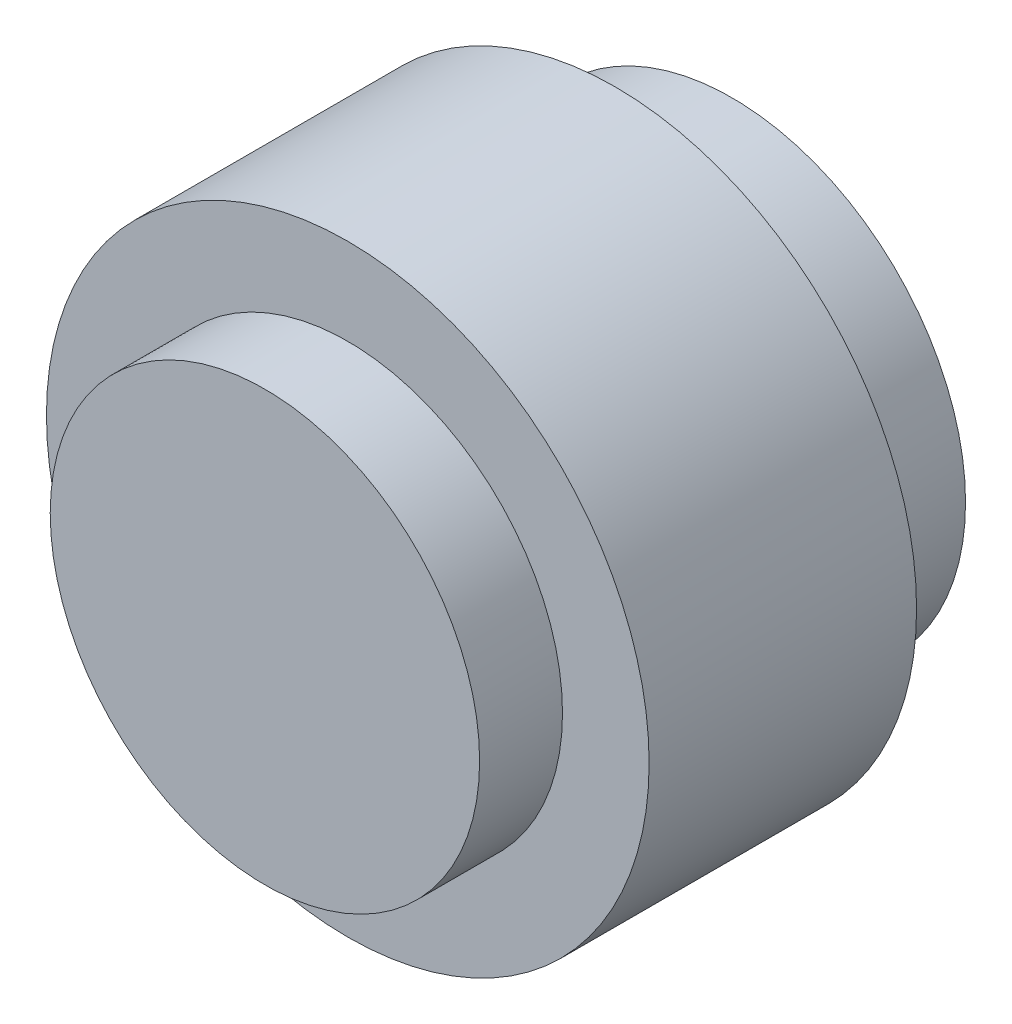
ISO-10303-21;
HEADER;
FILE_DESCRIPTION(('STEP AP214'),'2;1');
FILE_NAME('part.step','',(''),(''),'','','');
FILE_SCHEMA(('AUTOMOTIVE_DESIGN { 1 0 10303 214 1 1 1 1 }'));
ENDSEC;
DATA;
#1=APPLICATION_CONTEXT('core data for automotive mechanical design processes');
#2=APPLICATION_PROTOCOL_DEFINITION('international standard','automotive_design',2000,#1);
#3=PRODUCT_CONTEXT('',#1,'mechanical');
#4=PRODUCT('Part','Part','',(#3));
#5=PRODUCT_RELATED_PRODUCT_CATEGORY('part','',(#4));
#6=PRODUCT_DEFINITION_FORMATION('','',#4);
#7=PRODUCT_DEFINITION_CONTEXT('part definition',#1,'design');
#8=PRODUCT_DEFINITION('design','',#6,#7);
#9=PRODUCT_DEFINITION_SHAPE('','',#8);
#10=(LENGTH_UNIT() NAMED_UNIT(*) SI_UNIT(.MILLI.,.METRE.));
#11=(NAMED_UNIT(*) PLANE_ANGLE_UNIT() SI_UNIT($,.RADIAN.));
#12=(NAMED_UNIT(*) SI_UNIT($,.STERADIAN.) SOLID_ANGLE_UNIT());
#13=UNCERTAINTY_MEASURE_WITH_UNIT(LENGTH_MEASURE(1.E-05),#10,'distance_accuracy_value','');
#14=(GEOMETRIC_REPRESENTATION_CONTEXT(3) GLOBAL_UNCERTAINTY_ASSIGNED_CONTEXT((#13)) GLOBAL_UNIT_ASSIGNED_CONTEXT((#10,
#11,#12)) REPRESENTATION_CONTEXT('',''));
#15=CARTESIAN_POINT('',(0.,0.,0.));
#16=DIRECTION('',(0.,0.,1.));
#17=DIRECTION('',(1.,0.,0.));
#18=AXIS2_PLACEMENT_3D('',#15,#16,#17);
#19=CARTESIAN_POINT('',(0.,0.,-35.5));
#20=DIRECTION('',(0.,0.,1.));
#21=DIRECTION('',(1.,0.,0.));
#22=AXIS2_PLACEMENT_3D('',#19,#20,#21);
#23=PLANE('',#22);
#24=CARTESIAN_POINT('',(0.,0.,-35.5));
#25=DIRECTION('',(0.,0.,1.));
#26=DIRECTION('',(1.,0.,0.));
#27=AXIS2_PLACEMENT_3D('',#24,#25,#26);
#28=CIRCLE('',#27,40.);
#29=CARTESIAN_POINT('',(40.,0.,-35.5));
#30=VERTEX_POINT('',#29);
#31=EDGE_CURVE('E162',#30,#30,#28,.T.);
#32=ORIENTED_EDGE('',*,*,#31,.F.);
#33=EDGE_LOOP('',(#32));
#34=FACE_BOUND('',#33,.T.);
#35=CARTESIAN_POINT('',(26.1629509039017,26.162950903901,-35.5));
#36=DIRECTION('',(0.,0.,-1.));
#37=DIRECTION('',(-1.,0.,0.));
#38=AXIS2_PLACEMENT_3D('',#35,#36,#37);
#39=CIRCLE('',#38,1.525);
#40=CARTESIAN_POINT('',(24.6379509039017,26.162950903901,-35.5));
#41=VERTEX_POINT('',#40);
#42=EDGE_CURVE('E152',#41,#41,#39,.T.);
#43=ORIENTED_EDGE('',*,*,#42,.F.);
#44=EDGE_LOOP('',(#43));
#45=FACE_BOUND('',#44,.T.);
#46=CARTESIAN_POINT('',(36.9999999999982,-1.78707745073788E-12,-35.5));
#47=DIRECTION('',(0.,0.,-1.));
#48=DIRECTION('',(-1.,0.,0.));
#49=AXIS2_PLACEMENT_3D('',#46,#47,#48);
#50=CIRCLE('',#49,1.525);
#51=CARTESIAN_POINT('',(35.4749999999982,-1.78707745073788E-12,-35.5));
#52=VERTEX_POINT('',#51);
#53=EDGE_CURVE('E143',#52,#52,#50,.T.);
#54=ORIENTED_EDGE('',*,*,#53,.F.);
#55=EDGE_LOOP('',(#54));
#56=FACE_BOUND('',#55,.T.);
#57=CARTESIAN_POINT('',(26.1629509038992,-26.1629509039035,-35.5));
#58=DIRECTION('',(0.,0.,-1.));
#59=DIRECTION('',(-1.,0.,0.));
#60=AXIS2_PLACEMENT_3D('',#57,#58,#59);
#61=CIRCLE('',#60,1.525);
#62=CARTESIAN_POINT('',(24.6379509038992,-26.1629509039035,-35.5));
#63=VERTEX_POINT('',#62);
#64=EDGE_CURVE('E134',#63,#63,#61,.T.);
#65=ORIENTED_EDGE('',*,*,#64,.F.);
#66=EDGE_LOOP('',(#65));
#67=FACE_BOUND('',#66,.T.);
#68=CARTESIAN_POINT('',(-3.56509251516207E-12,-37.,-35.5));
#69=DIRECTION('',(0.,0.,-1.));
#70=DIRECTION('',(-1.,0.,0.));
#71=AXIS2_PLACEMENT_3D('',#68,#69,#70);
#72=CIRCLE('',#71,1.525);
#73=CARTESIAN_POINT('',(-1.52500000000357,-37.,-35.5));
#74=VERTEX_POINT('',#73);
#75=EDGE_CURVE('E125',#74,#74,#72,.T.);
#76=ORIENTED_EDGE('',*,*,#75,.F.);
#77=EDGE_LOOP('',(#76));
#78=FACE_BOUND('',#77,.T.);
#79=CARTESIAN_POINT('',(-26.1629509039053,-26.162950903901,-35.5));
#80=DIRECTION('',(0.,0.,-1.));
#81=DIRECTION('',(-1.,0.,0.));
#82=AXIS2_PLACEMENT_3D('',#79,#80,#81);
#83=CIRCLE('',#82,1.525);
#84=CARTESIAN_POINT('',(-27.6879509039053,-26.162950903901,-35.5));
#85=VERTEX_POINT('',#84);
#86=EDGE_CURVE('E116',#85,#85,#83,.T.);
#87=ORIENTED_EDGE('',*,*,#86,.F.);
#88=EDGE_LOOP('',(#87));
#89=FACE_BOUND('',#88,.T.);
#90=CARTESIAN_POINT('',(-37.0000000000018,1.78254625758104E-12,-35.5));
#91=DIRECTION('',(0.,0.,-1.));
#92=DIRECTION('',(-1.,0.,0.));
#93=AXIS2_PLACEMENT_3D('',#90,#91,#92);
#94=CIRCLE('',#93,1.525);
#95=CARTESIAN_POINT('',(-38.5250000000018,1.78254625758104E-12,-35.5));
#96=VERTEX_POINT('',#95);
#97=EDGE_CURVE('E107',#96,#96,#94,.T.);
#98=ORIENTED_EDGE('',*,*,#97,.F.);
#99=EDGE_LOOP('',(#98));
#100=FACE_BOUND('',#99,.T.);
#101=CARTESIAN_POINT('',(-26.1629509039028,26.1629509039035,-35.5));
#102=DIRECTION('',(0.,0.,-1.));
#103=DIRECTION('',(-1.,0.,0.));
#104=AXIS2_PLACEMENT_3D('',#101,#102,#103);
#105=CIRCLE('',#104,1.525);
#106=CARTESIAN_POINT('',(-27.6879509039028,26.1629509039035,-35.5));
#107=VERTEX_POINT('',#106);
#108=EDGE_CURVE('E91',#107,#107,#105,.T.);
#109=ORIENTED_EDGE('',*,*,#108,.F.);
#110=EDGE_LOOP('',(#109));
#111=FACE_BOUND('',#110,.T.);
#112=CARTESIAN_POINT('',(0.,37.,-35.5));
#113=DIRECTION('',(0.,0.,-1.));
#114=DIRECTION('',(-1.,0.,0.));
#115=AXIS2_PLACEMENT_3D('',#112,#113,#114);
#116=CIRCLE('',#115,1.525);
#117=CARTESIAN_POINT('',(-1.525,37.,-35.5));
#118=VERTEX_POINT('',#117);
#119=EDGE_CURVE('E98',#118,#118,#116,.T.);
#120=ORIENTED_EDGE('',*,*,#119,.F.);
#121=EDGE_LOOP('',(#120));
#122=FACE_BOUND('',#121,.T.);
#123=CARTESIAN_POINT('',(0.,0.,-35.5));
#124=DIRECTION('',(0.,0.,1.));
#125=DIRECTION('',(1.,0.,0.));
#126=AXIS2_PLACEMENT_3D('',#123,#124,#125);
#127=CIRCLE('',#126,31.);
#128=CARTESIAN_POINT('',(31.,0.,-35.5));
#129=VERTEX_POINT('',#128);
#130=EDGE_CURVE('E11',#129,#129,#127,.F.);
#131=ORIENTED_EDGE('',*,*,#130,.F.);
#132=EDGE_LOOP('',(#131));
#133=FACE_BOUND('',#132,.T.);
#134=ADVANCED_FACE('F48',(#34,#45,#56,#67,#78,#89,#100,#111,#122,#133),#23,.F.);
#135=CARTESIAN_POINT('',(0.,0.,11.));
#136=DIRECTION('',(0.,0.,-1.));
#137=DIRECTION('',(-1.,0.,0.));
#138=AXIS2_PLACEMENT_3D('',#135,#136,#137);
#139=CYLINDRICAL_SURFACE('',#138,28.5);
#140=CARTESIAN_POINT('',(0.,0.,11.));
#141=DIRECTION('',(0.,0.,1.));
#142=DIRECTION('',(1.,0.,0.));
#143=AXIS2_PLACEMENT_3D('',#140,#141,#142);
#144=CIRCLE('',#143,28.5);
#145=CARTESIAN_POINT('',(28.5,0.,11.));
#146=VERTEX_POINT('',#145);
#147=EDGE_CURVE('E170',#146,#146,#144,.T.);
#148=ORIENTED_EDGE('',*,*,#147,.F.);
#149=EDGE_LOOP('',(#148));
#150=FACE_BOUND('',#149,.T.);
#151=CARTESIAN_POINT('',(0.,0.,0.));
#152=DIRECTION('',(0.,0.,1.));
#153=DIRECTION('',(1.,0.,0.));
#154=AXIS2_PLACEMENT_3D('',#151,#152,#153);
#155=CIRCLE('',#154,28.5);
#156=CARTESIAN_POINT('',(28.5,0.,0.));
#157=VERTEX_POINT('',#156);
#158=EDGE_CURVE('E165',#157,#157,#155,.T.);
#159=ORIENTED_EDGE('',*,*,#158,.T.);
#160=EDGE_LOOP('',(#159));
#161=FACE_BOUND('',#160,.T.);
#162=ADVANCED_FACE('F50',(#150,#161),#139,.T.);
#163=CARTESIAN_POINT('',(0.,0.,11.));
#164=DIRECTION('',(0.,0.,1.));
#165=DIRECTION('',(1.,0.,0.));
#166=AXIS2_PLACEMENT_3D('',#163,#164,#165);
#167=PLANE('',#166);
#168=ORIENTED_EDGE('',*,*,#147,.T.);
#169=EDGE_LOOP('',(#168));
#170=FACE_BOUND('',#169,.T.);
#171=ADVANCED_FACE('F196',(#170),#167,.T.);
#172=CARTESIAN_POINT('',(0.,0.,-35.5));
#173=DIRECTION('',(0.,0.,1.));
#174=DIRECTION('',(1.,0.,0.));
#175=AXIS2_PLACEMENT_3D('',#172,#173,#174);
#176=CYLINDRICAL_SURFACE('',#175,40.);
#177=ORIENTED_EDGE('',*,*,#31,.T.);
#178=EDGE_LOOP('',(#177));
#179=FACE_BOUND('',#178,.T.);
#180=CARTESIAN_POINT('',(0.,0.,0.));
#181=DIRECTION('',(0.,0.,1.));
#182=DIRECTION('',(1.,0.,0.));
#183=AXIS2_PLACEMENT_3D('',#180,#181,#182);
#184=CIRCLE('',#183,40.);
#185=CARTESIAN_POINT('',(40.,0.,0.));
#186=VERTEX_POINT('',#185);
#187=EDGE_CURVE('E161',#186,#186,#184,.T.);
#188=ORIENTED_EDGE('',*,*,#187,.F.);
#189=EDGE_LOOP('',(#188));
#190=FACE_BOUND('',#189,.T.);
#191=ADVANCED_FACE('F206',(#179,#190),#176,.T.);
#192=CARTESIAN_POINT('',(0.,0.,0.));
#193=DIRECTION('',(0.,0.,1.));
#194=DIRECTION('',(1.,0.,0.));
#195=AXIS2_PLACEMENT_3D('',#192,#193,#194);
#196=PLANE('',#195);
#197=ORIENTED_EDGE('',*,*,#158,.F.);
#198=EDGE_LOOP('',(#197));
#199=FACE_BOUND('',#198,.T.);
#200=ORIENTED_EDGE('',*,*,#187,.T.);
#201=EDGE_LOOP('',(#200));
#202=FACE_BOUND('',#201,.T.);
#203=ADVANCED_FACE('F204',(#199,#202),#196,.T.);
#204=CARTESIAN_POINT('',(26.1629509039017,26.162950903901,-30.5));
#205=DIRECTION('',(0.,0.,-1.));
#206=DIRECTION('',(-1.,0.,0.));
#207=AXIS2_PLACEMENT_3D('',#204,#205,#206);
#208=CONICAL_SURFACE('',#207,1.25,1.02974425867665);
#209=CARTESIAN_POINT('',(26.1629509039017,26.162950903901,-29.7489242262155));
#210=VERTEX_POINT('',#209);
#211=VERTEX_LOOP('',#210);
#212=FACE_BOUND('',#211,.T.);
#213=CARTESIAN_POINT('',(26.1629509039017,26.162950903901,-30.5));
#214=DIRECTION('',(0.,0.,-1.));
#215=DIRECTION('',(-1.,0.,0.));
#216=AXIS2_PLACEMENT_3D('',#213,#214,#215);
#217=CIRCLE('',#216,1.25);
#218=CARTESIAN_POINT('',(24.9129509039017,26.162950903901,-30.5));
#219=VERTEX_POINT('',#218);
#220=EDGE_CURVE('E158',#219,#219,#217,.T.);
#221=ORIENTED_EDGE('',*,*,#220,.T.);
#222=EDGE_LOOP('',(#221));
#223=FACE_BOUND('',#222,.T.);
#224=ADVANCED_FACE('F202',(#212,#223),#208,.F.);
#225=CARTESIAN_POINT('',(26.1629509039017,26.162950903901,-35.5));
#226=DIRECTION('',(0.,0.,-1.));
#227=DIRECTION('',(-1.,0.,0.));
#228=AXIS2_PLACEMENT_3D('',#225,#226,#227);
#229=CYLINDRICAL_SURFACE('',#228,1.25);
#230=ORIENTED_EDGE('',*,*,#220,.F.);
#231=EDGE_LOOP('',(#230));
#232=FACE_BOUND('',#231,.T.);
#233=CARTESIAN_POINT('',(26.1629509039017,26.162950903901,-35.225));
#234=DIRECTION('',(0.,0.,-1.));
#235=DIRECTION('',(-1.,0.,0.));
#236=AXIS2_PLACEMENT_3D('',#233,#234,#235);
#237=CIRCLE('',#236,1.25);
#238=CARTESIAN_POINT('',(24.9129509039017,26.162950903901,-35.225));
#239=VERTEX_POINT('',#238);
#240=EDGE_CURVE('E155',#239,#239,#237,.T.);
#241=ORIENTED_EDGE('',*,*,#240,.T.);
#242=EDGE_LOOP('',(#241));
#243=FACE_BOUND('',#242,.T.);
#244=ADVANCED_FACE('F237',(#232,#243),#229,.F.);
#245=CARTESIAN_POINT('',(26.1629509039017,26.162950903901,-35.5));
#246=DIRECTION('',(0.,0.,-1.));
#247=DIRECTION('',(-1.,0.,0.));
#248=AXIS2_PLACEMENT_3D('',#245,#246,#247);
#249=CONICAL_SURFACE('',#248,1.525,0.785398163397448);
#250=ORIENTED_EDGE('',*,*,#240,.F.);
#251=EDGE_LOOP('',(#250));
#252=FACE_BOUND('',#251,.T.);
#253=ORIENTED_EDGE('',*,*,#42,.T.);
#254=EDGE_LOOP('',(#253));
#255=FACE_BOUND('',#254,.T.);
#256=ADVANCED_FACE('F244',(#252,#255),#249,.F.);
#257=CARTESIAN_POINT('',(36.9999999999982,-1.78707745073788E-12,-30.5));
#258=DIRECTION('',(0.,0.,-1.));
#259=DIRECTION('',(-1.,0.,0.));
#260=AXIS2_PLACEMENT_3D('',#257,#258,#259);
#261=CONICAL_SURFACE('',#260,1.25,1.02974425867666);
#262=CARTESIAN_POINT('',(36.9999999999982,-1.78707745073788E-12,-29.7489242262155));
#263=VERTEX_POINT('',#262);
#264=VERTEX_LOOP('',#263);
#265=FACE_BOUND('',#264,.T.);
#266=CARTESIAN_POINT('',(36.9999999999982,-1.78707745073788E-12,-30.5));
#267=DIRECTION('',(0.,0.,-1.));
#268=DIRECTION('',(-1.,0.,0.));
#269=AXIS2_PLACEMENT_3D('',#266,#267,#268);
#270=CIRCLE('',#269,1.25);
#271=CARTESIAN_POINT('',(35.7499999999982,-1.78707745073788E-12,-30.5));
#272=VERTEX_POINT('',#271);
#273=EDGE_CURVE('E149',#272,#272,#270,.T.);
#274=ORIENTED_EDGE('',*,*,#273,.T.);
#275=EDGE_LOOP('',(#274));
#276=FACE_BOUND('',#275,.T.);
#277=ADVANCED_FACE('F252',(#265,#276),#261,.F.);
#278=CARTESIAN_POINT('',(36.9999999999982,-1.78707745073788E-12,-35.5));
#279=DIRECTION('',(0.,0.,-1.));
#280=DIRECTION('',(-1.,0.,0.));
#281=AXIS2_PLACEMENT_3D('',#278,#279,#280);
#282=CYLINDRICAL_SURFACE('',#281,1.25);
#283=ORIENTED_EDGE('',*,*,#273,.F.);
#284=EDGE_LOOP('',(#283));
#285=FACE_BOUND('',#284,.T.);
#286=CARTESIAN_POINT('',(36.9999999999982,-1.78707745073788E-12,-35.225));
#287=DIRECTION('',(0.,0.,-1.));
#288=DIRECTION('',(-1.,0.,0.));
#289=AXIS2_PLACEMENT_3D('',#286,#287,#288);
#290=CIRCLE('',#289,1.25);
#291=CARTESIAN_POINT('',(35.7499999999982,-1.78707745073788E-12,-35.225));
#292=VERTEX_POINT('',#291);
#293=EDGE_CURVE('E146',#292,#292,#290,.T.);
#294=ORIENTED_EDGE('',*,*,#293,.T.);
#295=EDGE_LOOP('',(#294));
#296=FACE_BOUND('',#295,.T.);
#297=ADVANCED_FACE('F262',(#285,#296),#282,.F.);
#298=CARTESIAN_POINT('',(36.9999999999982,-1.78707745073788E-12,-35.5));
#299=DIRECTION('',(0.,0.,-1.));
#300=DIRECTION('',(-1.,0.,0.));
#301=AXIS2_PLACEMENT_3D('',#298,#299,#300);
#302=CONICAL_SURFACE('',#301,1.525,0.785398163397448);
#303=ORIENTED_EDGE('',*,*,#293,.F.);
#304=EDGE_LOOP('',(#303));
#305=FACE_BOUND('',#304,.T.);
#306=ORIENTED_EDGE('',*,*,#53,.T.);
#307=EDGE_LOOP('',(#306));
#308=FACE_BOUND('',#307,.T.);
#309=ADVANCED_FACE('F269',(#305,#308),#302,.F.);
#310=CARTESIAN_POINT('',(26.1629509038992,-26.1629509039035,-30.5));
#311=DIRECTION('',(0.,0.,-1.));
#312=DIRECTION('',(-1.,0.,0.));
#313=AXIS2_PLACEMENT_3D('',#310,#311,#312);
#314=CONICAL_SURFACE('',#313,1.25,1.02974425867665);
#315=CARTESIAN_POINT('',(26.1629509038992,-26.1629509039035,-29.7489242262155));
#316=VERTEX_POINT('',#315);
#317=VERTEX_LOOP('',#316);
#318=FACE_BOUND('',#317,.T.);
#319=CARTESIAN_POINT('',(26.1629509038992,-26.1629509039035,-30.5));
#320=DIRECTION('',(0.,0.,-1.));
#321=DIRECTION('',(-1.,0.,0.));
#322=AXIS2_PLACEMENT_3D('',#319,#320,#321);
#323=CIRCLE('',#322,1.25);
#324=CARTESIAN_POINT('',(24.9129509038992,-26.1629509039035,-30.5));
#325=VERTEX_POINT('',#324);
#326=EDGE_CURVE('E140',#325,#325,#323,.T.);
#327=ORIENTED_EDGE('',*,*,#326,.T.);
#328=EDGE_LOOP('',(#327));
#329=FACE_BOUND('',#328,.T.);
#330=ADVANCED_FACE('F278',(#318,#329),#314,.F.);
#331=CARTESIAN_POINT('',(26.1629509038992,-26.1629509039035,-35.5));
#332=DIRECTION('',(0.,0.,-1.));
#333=DIRECTION('',(-1.,0.,0.));
#334=AXIS2_PLACEMENT_3D('',#331,#332,#333);
#335=CYLINDRICAL_SURFACE('',#334,1.25);
#336=ORIENTED_EDGE('',*,*,#326,.F.);
#337=EDGE_LOOP('',(#336));
#338=FACE_BOUND('',#337,.T.);
#339=CARTESIAN_POINT('',(26.1629509038992,-26.1629509039035,-35.225));
#340=DIRECTION('',(0.,0.,-1.));
#341=DIRECTION('',(-1.,0.,0.));
#342=AXIS2_PLACEMENT_3D('',#339,#340,#341);
#343=CIRCLE('',#342,1.25);
#344=CARTESIAN_POINT('',(24.9129509038992,-26.1629509039035,-35.225));
#345=VERTEX_POINT('',#344);
#346=EDGE_CURVE('E137',#345,#345,#343,.T.);
#347=ORIENTED_EDGE('',*,*,#346,.T.);
#348=EDGE_LOOP('',(#347));
#349=FACE_BOUND('',#348,.T.);
#350=ADVANCED_FACE('F287',(#338,#349),#335,.F.);
#351=CARTESIAN_POINT('',(26.1629509038992,-26.1629509039035,-35.5));
#352=DIRECTION('',(0.,0.,-1.));
#353=DIRECTION('',(-1.,0.,0.));
#354=AXIS2_PLACEMENT_3D('',#351,#352,#353);
#355=CONICAL_SURFACE('',#354,1.525,0.785398163397448);
#356=ORIENTED_EDGE('',*,*,#346,.F.);
#357=EDGE_LOOP('',(#356));
#358=FACE_BOUND('',#357,.T.);
#359=ORIENTED_EDGE('',*,*,#64,.T.);
#360=EDGE_LOOP('',(#359));
#361=FACE_BOUND('',#360,.T.);
#362=ADVANCED_FACE('F295',(#358,#361),#355,.F.);
#363=CARTESIAN_POINT('',(-3.56509251516207E-12,-37.,-30.5));
#364=DIRECTION('',(0.,0.,-1.));
#365=DIRECTION('',(-1.,0.,0.));
#366=AXIS2_PLACEMENT_3D('',#363,#364,#365);
#367=CONICAL_SURFACE('',#366,1.25,1.02974425867665);
#368=CARTESIAN_POINT('',(-3.56650732173882E-12,-37.,-29.7489242262155));
#369=VERTEX_POINT('',#368);
#370=VERTEX_LOOP('',#369);
#371=FACE_BOUND('',#370,.T.);
#372=CARTESIAN_POINT('',(-3.56509251516207E-12,-37.,-30.5));
#373=DIRECTION('',(0.,0.,-1.));
#374=DIRECTION('',(-1.,0.,0.));
#375=AXIS2_PLACEMENT_3D('',#372,#373,#374);
#376=CIRCLE('',#375,1.25);
#377=CARTESIAN_POINT('',(-1.25000000000356,-37.,-30.5));
#378=VERTEX_POINT('',#377);
#379=EDGE_CURVE('E131',#378,#378,#376,.T.);
#380=ORIENTED_EDGE('',*,*,#379,.T.);
#381=EDGE_LOOP('',(#380));
#382=FACE_BOUND('',#381,.T.);
#383=ADVANCED_FACE('F304',(#371,#382),#367,.F.);
#384=CARTESIAN_POINT('',(-3.56509251516207E-12,-37.,-35.5));
#385=DIRECTION('',(0.,0.,-1.));
#386=DIRECTION('',(-1.,0.,0.));
#387=AXIS2_PLACEMENT_3D('',#384,#385,#386);
#388=CYLINDRICAL_SURFACE('',#387,1.25);
#389=ORIENTED_EDGE('',*,*,#379,.F.);
#390=EDGE_LOOP('',(#389));
#391=FACE_BOUND('',#390,.T.);
#392=CARTESIAN_POINT('',(-3.56509251516207E-12,-37.,-35.225));
#393=DIRECTION('',(0.,0.,-1.));
#394=DIRECTION('',(-1.,0.,0.));
#395=AXIS2_PLACEMENT_3D('',#392,#393,#394);
#396=CIRCLE('',#395,1.25);
#397=CARTESIAN_POINT('',(-1.25000000000356,-37.,-35.225));
#398=VERTEX_POINT('',#397);
#399=EDGE_CURVE('E128',#398,#398,#396,.T.);
#400=ORIENTED_EDGE('',*,*,#399,.T.);
#401=EDGE_LOOP('',(#400));
#402=FACE_BOUND('',#401,.T.);
#403=ADVANCED_FACE('F313',(#391,#402),#388,.F.);
#404=CARTESIAN_POINT('',(-3.56509251516207E-12,-37.,-35.5));
#405=DIRECTION('',(0.,0.,-1.));
#406=DIRECTION('',(-1.,0.,0.));
#407=AXIS2_PLACEMENT_3D('',#404,#405,#406);
#408=CONICAL_SURFACE('',#407,1.525,0.785398163397454);
#409=ORIENTED_EDGE('',*,*,#399,.F.);
#410=EDGE_LOOP('',(#409));
#411=FACE_BOUND('',#410,.T.);
#412=ORIENTED_EDGE('',*,*,#75,.T.);
#413=EDGE_LOOP('',(#412));
#414=FACE_BOUND('',#413,.T.);
#415=ADVANCED_FACE('F321',(#411,#414),#408,.F.);
#416=CARTESIAN_POINT('',(-26.1629509039053,-26.162950903901,-30.5));
#417=DIRECTION('',(0.,0.,-1.));
#418=DIRECTION('',(-1.,0.,0.));
#419=AXIS2_PLACEMENT_3D('',#416,#417,#418);
#420=CONICAL_SURFACE('',#419,1.25,1.02974425867665);
#421=CARTESIAN_POINT('',(-26.1629509039053,-26.162950903901,-29.7489242262155));
#422=VERTEX_POINT('',#421);
#423=VERTEX_LOOP('',#422);
#424=FACE_BOUND('',#423,.T.);
#425=CARTESIAN_POINT('',(-26.1629509039053,-26.162950903901,-30.5));
#426=DIRECTION('',(0.,0.,-1.));
#427=DIRECTION('',(-1.,0.,0.));
#428=AXIS2_PLACEMENT_3D('',#425,#426,#427);
#429=CIRCLE('',#428,1.25);
#430=CARTESIAN_POINT('',(-27.4129509039053,-26.162950903901,-30.5));
#431=VERTEX_POINT('',#430);
#432=EDGE_CURVE('E122',#431,#431,#429,.T.);
#433=ORIENTED_EDGE('',*,*,#432,.T.);
#434=EDGE_LOOP('',(#433));
#435=FACE_BOUND('',#434,.T.);
#436=ADVANCED_FACE('F330',(#424,#435),#420,.F.);
#437=CARTESIAN_POINT('',(-26.1629509039053,-26.162950903901,-35.5));
#438=DIRECTION('',(0.,0.,-1.));
#439=DIRECTION('',(-1.,0.,0.));
#440=AXIS2_PLACEMENT_3D('',#437,#438,#439);
#441=CYLINDRICAL_SURFACE('',#440,1.25);
#442=ORIENTED_EDGE('',*,*,#432,.F.);
#443=EDGE_LOOP('',(#442));
#444=FACE_BOUND('',#443,.T.);
#445=CARTESIAN_POINT('',(-26.1629509039053,-26.162950903901,-35.225));
#446=DIRECTION('',(0.,0.,-1.));
#447=DIRECTION('',(-1.,0.,0.));
#448=AXIS2_PLACEMENT_3D('',#445,#446,#447);
#449=CIRCLE('',#448,1.25);
#450=CARTESIAN_POINT('',(-27.4129509039053,-26.162950903901,-35.225));
#451=VERTEX_POINT('',#450);
#452=EDGE_CURVE('E119',#451,#451,#449,.T.);
#453=ORIENTED_EDGE('',*,*,#452,.T.);
#454=EDGE_LOOP('',(#453));
#455=FACE_BOUND('',#454,.T.);
#456=ADVANCED_FACE('F339',(#444,#455),#441,.F.);
#457=CARTESIAN_POINT('',(-26.1629509039053,-26.162950903901,-35.5));
#458=DIRECTION('',(0.,0.,-1.));
#459=DIRECTION('',(-1.,0.,0.));
#460=AXIS2_PLACEMENT_3D('',#457,#458,#459);
#461=CONICAL_SURFACE('',#460,1.525,0.785398163397448);
#462=ORIENTED_EDGE('',*,*,#452,.F.);
#463=EDGE_LOOP('',(#462));
#464=FACE_BOUND('',#463,.T.);
#465=ORIENTED_EDGE('',*,*,#86,.T.);
#466=EDGE_LOOP('',(#465));
#467=FACE_BOUND('',#466,.T.);
#468=ADVANCED_FACE('F347',(#464,#467),#461,.F.);
#469=CARTESIAN_POINT('',(-37.0000000000018,1.78254625758104E-12,-30.5));
#470=DIRECTION('',(0.,0.,-1.));
#471=DIRECTION('',(-1.,0.,0.));
#472=AXIS2_PLACEMENT_3D('',#469,#470,#471);
#473=CONICAL_SURFACE('',#472,1.25,1.02974425867666);
#474=CARTESIAN_POINT('',(-37.0000000000018,1.78254625758104E-12,-29.7489242262155));
#475=VERTEX_POINT('',#474);
#476=VERTEX_LOOP('',#475);
#477=FACE_BOUND('',#476,.T.);
#478=CARTESIAN_POINT('',(-37.0000000000018,1.78254625758104E-12,-30.5));
#479=DIRECTION('',(0.,0.,-1.));
#480=DIRECTION('',(-1.,0.,0.));
#481=AXIS2_PLACEMENT_3D('',#478,#479,#480);
#482=CIRCLE('',#481,1.25);
#483=CARTESIAN_POINT('',(-38.2500000000018,1.78254625758104E-12,-30.5));
#484=VERTEX_POINT('',#483);
#485=EDGE_CURVE('E113',#484,#484,#482,.T.);
#486=ORIENTED_EDGE('',*,*,#485,.T.);
#487=EDGE_LOOP('',(#486));
#488=FACE_BOUND('',#487,.T.);
#489=ADVANCED_FACE('F356',(#477,#488),#473,.F.);
#490=CARTESIAN_POINT('',(-37.0000000000018,1.78254625758104E-12,-35.5));
#491=DIRECTION('',(0.,0.,-1.));
#492=DIRECTION('',(-1.,0.,0.));
#493=AXIS2_PLACEMENT_3D('',#490,#491,#492);
#494=CYLINDRICAL_SURFACE('',#493,1.25);
#495=ORIENTED_EDGE('',*,*,#485,.F.);
#496=EDGE_LOOP('',(#495));
#497=FACE_BOUND('',#496,.T.);
#498=CARTESIAN_POINT('',(-37.0000000000018,1.78254625758104E-12,-35.225));
#499=DIRECTION('',(0.,0.,-1.));
#500=DIRECTION('',(-1.,0.,0.));
#501=AXIS2_PLACEMENT_3D('',#498,#499,#500);
#502=CIRCLE('',#501,1.25);
#503=CARTESIAN_POINT('',(-38.2500000000018,1.78254625758104E-12,-35.225));
#504=VERTEX_POINT('',#503);
#505=EDGE_CURVE('E110',#504,#504,#502,.T.);
#506=ORIENTED_EDGE('',*,*,#505,.T.);
#507=EDGE_LOOP('',(#506));
#508=FACE_BOUND('',#507,.T.);
#509=ADVANCED_FACE('F365',(#497,#508),#494,.F.);
#510=CARTESIAN_POINT('',(-37.0000000000018,1.78254625758104E-12,-35.5));
#511=DIRECTION('',(0.,0.,-1.));
#512=DIRECTION('',(-1.,0.,0.));
#513=AXIS2_PLACEMENT_3D('',#510,#511,#512);
#514=CONICAL_SURFACE('',#513,1.525,0.785398163397448);
#515=ORIENTED_EDGE('',*,*,#505,.F.);
#516=EDGE_LOOP('',(#515));
#517=FACE_BOUND('',#516,.T.);
#518=ORIENTED_EDGE('',*,*,#97,.T.);
#519=EDGE_LOOP('',(#518));
#520=FACE_BOUND('',#519,.T.);
#521=ADVANCED_FACE('F373',(#517,#520),#514,.F.);
#522=CARTESIAN_POINT('',(-26.1629509039028,26.1629509039035,-30.5));
#523=DIRECTION('',(0.,0.,-1.));
#524=DIRECTION('',(-1.,0.,0.));
#525=AXIS2_PLACEMENT_3D('',#522,#523,#524);
#526=CONICAL_SURFACE('',#525,1.25,1.02974425867665);
#527=CARTESIAN_POINT('',(-26.1629509039028,26.1629509039035,-29.7489242262155));
#528=VERTEX_POINT('',#527);
#529=VERTEX_LOOP('',#528);
#530=FACE_BOUND('',#529,.T.);
#531=CARTESIAN_POINT('',(-26.1629509039028,26.1629509039035,-30.5));
#532=DIRECTION('',(0.,0.,-1.));
#533=DIRECTION('',(-1.,0.,0.));
#534=AXIS2_PLACEMENT_3D('',#531,#532,#533);
#535=CIRCLE('',#534,1.25);
#536=CARTESIAN_POINT('',(-27.4129509039028,26.1629509039035,-30.5));
#537=VERTEX_POINT('',#536);
#538=EDGE_CURVE('E104',#537,#537,#535,.T.);
#539=ORIENTED_EDGE('',*,*,#538,.T.);
#540=EDGE_LOOP('',(#539));
#541=FACE_BOUND('',#540,.T.);
#542=ADVANCED_FACE('F382',(#530,#541),#526,.F.);
#543=CARTESIAN_POINT('',(-26.1629509039028,26.1629509039035,-35.5));
#544=DIRECTION('',(0.,0.,-1.));
#545=DIRECTION('',(-1.,0.,0.));
#546=AXIS2_PLACEMENT_3D('',#543,#544,#545);
#547=CYLINDRICAL_SURFACE('',#546,1.25);
#548=ORIENTED_EDGE('',*,*,#538,.F.);
#549=EDGE_LOOP('',(#548));
#550=FACE_BOUND('',#549,.T.);
#551=CARTESIAN_POINT('',(-26.1629509039028,26.1629509039035,-35.225));
#552=DIRECTION('',(0.,0.,-1.));
#553=DIRECTION('',(-1.,0.,0.));
#554=AXIS2_PLACEMENT_3D('',#551,#552,#553);
#555=CIRCLE('',#554,1.25);
#556=CARTESIAN_POINT('',(-27.4129509039028,26.1629509039035,-35.225));
#557=VERTEX_POINT('',#556);
#558=EDGE_CURVE('E95',#557,#557,#555,.T.);
#559=ORIENTED_EDGE('',*,*,#558,.T.);
#560=EDGE_LOOP('',(#559));
#561=FACE_BOUND('',#560,.T.);
#562=ADVANCED_FACE('F391',(#550,#561),#547,.F.);
#563=CARTESIAN_POINT('',(-26.1629509039028,26.1629509039035,-35.5));
#564=DIRECTION('',(0.,0.,-1.));
#565=DIRECTION('',(-1.,0.,0.));
#566=AXIS2_PLACEMENT_3D('',#563,#564,#565);
#567=CONICAL_SURFACE('',#566,1.525,0.785398163397455);
#568=ORIENTED_EDGE('',*,*,#558,.F.);
#569=EDGE_LOOP('',(#568));
#570=FACE_BOUND('',#569,.T.);
#571=ORIENTED_EDGE('',*,*,#108,.T.);
#572=EDGE_LOOP('',(#571));
#573=FACE_BOUND('',#572,.T.);
#574=ADVANCED_FACE('F85',(#570,#573),#567,.F.);
#575=CARTESIAN_POINT('',(0.,37.,-30.5));
#576=DIRECTION('',(0.,0.,-1.));
#577=DIRECTION('',(-1.,0.,0.));
#578=AXIS2_PLACEMENT_3D('',#575,#576,#577);
#579=CONICAL_SURFACE('',#578,1.25,1.02974425867665);
#580=CARTESIAN_POINT('',(0.,37.,-29.7489242262155));
#581=VERTEX_POINT('',#580);
#582=VERTEX_LOOP('',#581);
#583=FACE_BOUND('',#582,.T.);
#584=CARTESIAN_POINT('',(0.,37.,-30.5));
#585=DIRECTION('',(0.,0.,-1.));
#586=DIRECTION('',(-1.,0.,0.));
#587=AXIS2_PLACEMENT_3D('',#584,#585,#586);
#588=CIRCLE('',#587,1.25);
#589=CARTESIAN_POINT('',(-1.25,37.,-30.5));
#590=VERTEX_POINT('',#589);
#591=EDGE_CURVE('E89',#590,#590,#588,.T.);
#592=ORIENTED_EDGE('',*,*,#591,.T.);
#593=EDGE_LOOP('',(#592));
#594=FACE_BOUND('',#593,.T.);
#595=ADVANCED_FACE('F81',(#583,#594),#579,.F.);
#596=CARTESIAN_POINT('',(0.,37.,-35.5));
#597=DIRECTION('',(0.,0.,-1.));
#598=DIRECTION('',(-1.,0.,0.));
#599=AXIS2_PLACEMENT_3D('',#596,#597,#598);
#600=CYLINDRICAL_SURFACE('',#599,1.25);
#601=ORIENTED_EDGE('',*,*,#591,.F.);
#602=EDGE_LOOP('',(#601));
#603=FACE_BOUND('',#602,.T.);
#604=CARTESIAN_POINT('',(0.,37.,-35.225));
#605=DIRECTION('',(0.,0.,-1.));
#606=DIRECTION('',(-1.,0.,0.));
#607=AXIS2_PLACEMENT_3D('',#604,#605,#606);
#608=CIRCLE('',#607,1.25);
#609=CARTESIAN_POINT('',(-1.25,37.,-35.225));
#610=VERTEX_POINT('',#609);
#611=EDGE_CURVE('E92',#610,#610,#608,.T.);
#612=ORIENTED_EDGE('',*,*,#611,.T.);
#613=EDGE_LOOP('',(#612));
#614=FACE_BOUND('',#613,.T.);
#615=ADVANCED_FACE('F84',(#603,#614),#600,.F.);
#616=CARTESIAN_POINT('',(0.,37.,-35.5));
#617=DIRECTION('',(0.,0.,-1.));
#618=DIRECTION('',(-1.,0.,0.));
#619=AXIS2_PLACEMENT_3D('',#616,#617,#618);
#620=CONICAL_SURFACE('',#619,1.525,0.785398163397454);
#621=ORIENTED_EDGE('',*,*,#611,.F.);
#622=EDGE_LOOP('',(#621));
#623=FACE_BOUND('',#622,.T.);
#624=ORIENTED_EDGE('',*,*,#119,.T.);
#625=EDGE_LOOP('',(#624));
#626=FACE_BOUND('',#625,.T.);
#627=ADVANCED_FACE('F419',(#623,#626),#620,.F.);
#628=CARTESIAN_POINT('',(0.,0.,-51.));
#629=DIRECTION('',(0.,0.,-1.));
#630=DIRECTION('',(-1.,0.,0.));
#631=AXIS2_PLACEMENT_3D('',#628,#629,#630);
#632=PLANE('',#631);
#633=CARTESIAN_POINT('',(0.,0.,-51.));
#634=DIRECTION('',(0.,0.,-1.));
#635=DIRECTION('',(-1.,0.,0.));
#636=AXIS2_PLACEMENT_3D('',#633,#634,#635);
#637=CIRCLE('',#636,31.);
#638=CARTESIAN_POINT('',(-31.,0.,-51.));
#639=VERTEX_POINT('',#638);
#640=EDGE_CURVE('E608',#639,#639,#637,.T.);
#641=ORIENTED_EDGE('',*,*,#640,.T.);
#642=EDGE_LOOP('',(#641));
#643=FACE_BOUND('',#642,.T.);
#644=CARTESIAN_POINT('',(0.,0.,-51.));
#645=DIRECTION('',(0.,0.,-1.));
#646=DIRECTION('',(-1.,0.,0.));
#647=AXIS2_PLACEMENT_3D('',#644,#645,#646);
#648=CIRCLE('',#647,21.);
#649=CARTESIAN_POINT('',(-21.,0.,-51.));
#650=VERTEX_POINT('',#649);
#651=EDGE_CURVE('E611',#650,#650,#648,.T.);
#652=ORIENTED_EDGE('',*,*,#651,.F.);
#653=EDGE_LOOP('',(#652));
#654=FACE_BOUND('',#653,.T.);
#655=ADVANCED_FACE('F186',(#643,#654),#632,.T.);
#656=CARTESIAN_POINT('',(0.,0.,-51.));
#657=DIRECTION('',(0.,0.,1.));
#658=DIRECTION('',(1.,0.,0.));
#659=AXIS2_PLACEMENT_3D('',#656,#657,#658);
#660=CYLINDRICAL_SURFACE('',#659,31.);
#661=ORIENTED_EDGE('',*,*,#640,.F.);
#662=EDGE_LOOP('',(#661));
#663=FACE_BOUND('',#662,.T.);
#664=ORIENTED_EDGE('',*,*,#130,.T.);
#665=EDGE_LOOP('',(#664));
#666=FACE_BOUND('',#665,.T.);
#667=ADVANCED_FACE('F180',(#663,#666),#660,.T.);
#668=CARTESIAN_POINT('',(0.,0.,0.));
#669=DIRECTION('',(0.,0.,1.));
#670=DIRECTION('',(1.,0.,0.));
#671=AXIS2_PLACEMENT_3D('',#668,#669,#670);
#672=PLANE('',#671);
#673=CARTESIAN_POINT('',(0.,0.,0.));
#674=DIRECTION('',(0.,0.,1.));
#675=DIRECTION('',(1.,0.,0.));
#676=AXIS2_PLACEMENT_3D('',#673,#674,#675);
#677=CIRCLE('',#676,21.);
#678=CARTESIAN_POINT('',(21.,0.,0.));
#679=VERTEX_POINT('',#678);
#680=EDGE_CURVE('E56',#679,#679,#677,.T.);
#681=ORIENTED_EDGE('',*,*,#680,.F.);
#682=EDGE_LOOP('',(#681));
#683=FACE_BOUND('',#682,.T.);
#684=ADVANCED_FACE('F178',(#683),#672,.F.);
#685=CARTESIAN_POINT('',(0.,0.,-35.5));
#686=DIRECTION('',(0.,0.,1.));
#687=DIRECTION('',(1.,0.,0.));
#688=AXIS2_PLACEMENT_3D('',#685,#686,#687);
#689=CYLINDRICAL_SURFACE('',#688,21.);
#690=ORIENTED_EDGE('',*,*,#680,.T.);
#691=EDGE_LOOP('',(#690));
#692=FACE_BOUND('',#691,.T.);
#693=ORIENTED_EDGE('',*,*,#651,.T.);
#694=EDGE_LOOP('',(#693));
#695=FACE_BOUND('',#694,.T.);
#696=ADVANCED_FACE('F175',(#692,#695),#689,.F.);
#697=CLOSED_SHELL('',(#134,#162,#171,#191,#203,#224,#244,#256,#277,#297,#309,#330,#350,#362,
#383,#403,#415,#436,#456,#468,#489,#509,#521,#542,#562,#574,#595,#615,#627,#655,#667,#684,#696));
#698=MANIFOLD_SOLID_BREP('B2',#697);
#699=ADVANCED_BREP_SHAPE_REPRESENTATION('',(#18,#698),#14);
#700=SHAPE_DEFINITION_REPRESENTATION(#9,#699);
ENDSEC;
END-ISO-10303-21;
